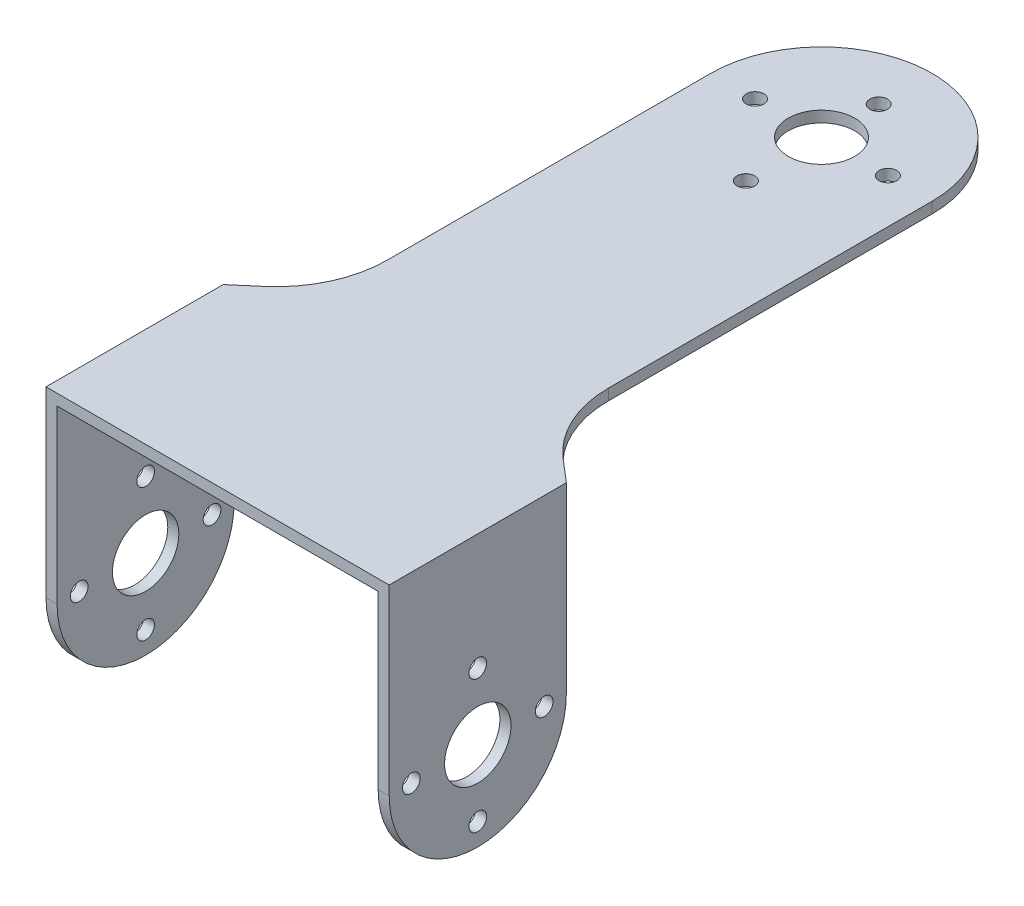
ISO-10303-21;
HEADER;
FILE_DESCRIPTION(('STEP AP214'),'2;1');
FILE_NAME('part.step','',(''),(''),'','','');
FILE_SCHEMA(('AUTOMOTIVE_DESIGN { 1 0 10303 214 1 1 1 1 }'));
ENDSEC;
DATA;
#1=APPLICATION_CONTEXT('core data for automotive mechanical design processes');
#2=APPLICATION_PROTOCOL_DEFINITION('international standard','automotive_design',2000,#1);
#3=PRODUCT_CONTEXT('',#1,'mechanical');
#4=PRODUCT('Part','Part','',(#3));
#5=PRODUCT_RELATED_PRODUCT_CATEGORY('part','',(#4));
#6=PRODUCT_DEFINITION_FORMATION('','',#4);
#7=PRODUCT_DEFINITION_CONTEXT('part definition',#1,'design');
#8=PRODUCT_DEFINITION('design','',#6,#7);
#9=PRODUCT_DEFINITION_SHAPE('','',#8);
#10=(LENGTH_UNIT() NAMED_UNIT(*) SI_UNIT(.MILLI.,.METRE.));
#11=(NAMED_UNIT(*) PLANE_ANGLE_UNIT() SI_UNIT($,.RADIAN.));
#12=(NAMED_UNIT(*) SI_UNIT($,.STERADIAN.) SOLID_ANGLE_UNIT());
#13=UNCERTAINTY_MEASURE_WITH_UNIT(LENGTH_MEASURE(1.E-05),#10,'distance_accuracy_value','');
#14=(GEOMETRIC_REPRESENTATION_CONTEXT(3) GLOBAL_UNCERTAINTY_ASSIGNED_CONTEXT((#13)) GLOBAL_UNIT_ASSIGNED_CONTEXT((#10,
#11,#12)) REPRESENTATION_CONTEXT('',''));
#15=CARTESIAN_POINT('',(0.,0.,0.));
#16=DIRECTION('',(0.,0.,1.));
#17=DIRECTION('',(1.,0.,0.));
#18=AXIS2_PLACEMENT_3D('',#15,#16,#17);
#19=CARTESIAN_POINT('',(31.,55.275594,-43.5206464472842));
#20=DIRECTION('',(0.,0.,1.));
#21=DIRECTION('',(1.,0.,0.));
#22=AXIS2_PLACEMENT_3D('',#19,#20,#21);
#23=PLANE('',#22);
#24=DIRECTION('',(0.,1.,0.));
#25=VECTOR('',#24,1.);
#26=CARTESIAN_POINT('',(0.999214171827738,55.275594,-43.5206464472842));
#27=LINE('',#26,#25);
#28=CARTESIAN_POINT('',(0.999214171827738,38.775594,-43.5206464472842));
#29=VERTEX_POINT('',#28);
#30=CARTESIAN_POINT('',(0.999214171827738,54.275594,-43.5206464472842));
#31=VERTEX_POINT('',#30);
#32=EDGE_CURVE('E161',#29,#31,#27,.T.);
#33=ORIENTED_EDGE('',*,*,#32,.F.);
#34=DIRECTION('',(-1.,0.,0.));
#35=VECTOR('',#34,1.);
#36=CARTESIAN_POINT('',(31.,38.775594,-43.5206464472842));
#37=LINE('',#36,#35);
#38=CARTESIAN_POINT('',(0.,38.775594,-43.5206464472842));
#39=VERTEX_POINT('',#38);
#40=EDGE_CURVE('E47',#29,#39,#37,.T.);
#41=ORIENTED_EDGE('',*,*,#40,.T.);
#42=DIRECTION('',(0.,1.,0.));
#43=VECTOR('',#42,1.);
#44=CARTESIAN_POINT('',(0.,55.275594,-43.5206464472842));
#45=LINE('',#44,#43);
#46=CARTESIAN_POINT('',(0.,54.275594,-43.5206464472842));
#47=VERTEX_POINT('',#46);
#48=EDGE_CURVE('E347',#39,#47,#45,.T.);
#49=ORIENTED_EDGE('',*,*,#48,.T.);
#50=DIRECTION('',(1.,0.,0.));
#51=VECTOR('',#50,1.);
#52=CARTESIAN_POINT('',(0.,54.275594,-43.5206464472842));
#53=LINE('',#52,#51);
#54=EDGE_CURVE('E252',#47,#31,#53,.T.);
#55=ORIENTED_EDGE('',*,*,#54,.T.);
#56=EDGE_LOOP('',(#33,#41,#49,#55));
#57=FACE_BOUND('',#56,.T.);
#58=ADVANCED_FACE('F39',(#57),#23,.F.);
#59=CARTESIAN_POINT('',(31.,38.775594,-35.5206464472841));
#60=DIRECTION('',(-1.,0.,0.));
#61=DIRECTION('',(0.,0.,1.));
#62=AXIS2_PLACEMENT_3D('',#59,#60,#61);
#63=CYLINDRICAL_SURFACE('',#62,8.);
#64=CARTESIAN_POINT('',(0.999214171827738,38.775594,-35.5206464472841));
#65=DIRECTION('',(1.,0.,0.));
#66=DIRECTION('',(0.,0.,-1.));
#67=AXIS2_PLACEMENT_3D('',#64,#65,#66);
#68=CIRCLE('',#67,8.);
#69=CARTESIAN_POINT('',(0.999214171827738,38.775594,-27.5206464472841));
#70=VERTEX_POINT('',#69);
#71=EDGE_CURVE('E213',#70,#29,#68,.T.);
#72=ORIENTED_EDGE('',*,*,#71,.F.);
#73=DIRECTION('',(-1.,0.,0.));
#74=VECTOR('',#73,1.);
#75=CARTESIAN_POINT('',(31.,38.775594,-27.5206464472841));
#76=LINE('',#75,#74);
#77=CARTESIAN_POINT('',(0.,38.775594,-27.5206464472841));
#78=VERTEX_POINT('',#77);
#79=EDGE_CURVE('E84',#70,#78,#76,.T.);
#80=ORIENTED_EDGE('',*,*,#79,.T.);
#81=CARTESIAN_POINT('',(0.,38.775594,-35.5206464472841));
#82=DIRECTION('',(1.,0.,0.));
#83=DIRECTION('',(0.,0.,-1.));
#84=AXIS2_PLACEMENT_3D('',#81,#82,#83);
#85=CIRCLE('',#84,8.);
#86=EDGE_CURVE('E336',#78,#39,#85,.T.);
#87=ORIENTED_EDGE('',*,*,#86,.T.);
#88=ORIENTED_EDGE('',*,*,#40,.F.);
#89=EDGE_LOOP('',(#72,#80,#87,#88));
#90=FACE_BOUND('',#89,.T.);
#91=ADVANCED_FACE('F41',(#90),#63,.T.);
#92=CARTESIAN_POINT('',(31.,38.775594,-27.5206464472841));
#93=VERTEX_POINT('',#92);
#94=CARTESIAN_POINT('',(30.0007858281723,38.775594,-27.5206464472841));
#95=VERTEX_POINT('',#94);
#96=EDGE_CURVE('E353',#93,#95,#76,.T.);
#97=ORIENTED_EDGE('',*,*,#96,.T.);
#98=CARTESIAN_POINT('',(30.0007858281723,38.775594,-35.5206464472841));
#99=DIRECTION('',(1.,0.,0.));
#100=DIRECTION('',(0.,0.,-1.));
#101=AXIS2_PLACEMENT_3D('',#98,#99,#100);
#102=CIRCLE('',#101,8.);
#103=CARTESIAN_POINT('',(30.0007858281723,38.775594,-43.5206464472842));
#104=VERTEX_POINT('',#103);
#105=EDGE_CURVE('E192',#95,#104,#102,.T.);
#106=ORIENTED_EDGE('',*,*,#105,.T.);
#107=CARTESIAN_POINT('',(31.,38.775594,-43.5206464472842));
#108=VERTEX_POINT('',#107);
#109=EDGE_CURVE('E11',#108,#104,#37,.T.);
#110=ORIENTED_EDGE('',*,*,#109,.F.);
#111=CARTESIAN_POINT('',(31.,38.775594,-35.5206464472841));
#112=DIRECTION('',(1.,0.,0.));
#113=DIRECTION('',(0.,0.,-1.));
#114=AXIS2_PLACEMENT_3D('',#111,#112,#113);
#115=CIRCLE('',#114,8.);
#116=EDGE_CURVE('E339',#93,#108,#115,.T.);
#117=ORIENTED_EDGE('',*,*,#116,.F.);
#118=EDGE_LOOP('',(#97,#106,#110,#117));
#119=FACE_BOUND('',#118,.T.);
#120=ADVANCED_FACE('F369',(#119),#63,.T.);
#121=CARTESIAN_POINT('',(31.,38.775594,-27.5206464472841));
#122=DIRECTION('',(0.,0.,-1.));
#123=DIRECTION('',(-1.,0.,0.));
#124=AXIS2_PLACEMENT_3D('',#121,#122,#123);
#125=PLANE('',#124);
#126=DIRECTION('',(0.,1.,0.));
#127=VECTOR('',#126,1.);
#128=CARTESIAN_POINT('',(0.999214171827738,30.775594,-27.5206464472841));
#129=LINE('',#128,#127);
#130=CARTESIAN_POINT('',(0.999214171827738,54.275594,-27.5206464472841));
#131=VERTEX_POINT('',#130);
#132=EDGE_CURVE('E159',#70,#131,#129,.T.);
#133=ORIENTED_EDGE('',*,*,#132,.T.);
#134=DIRECTION('',(1.,0.,0.));
#135=VECTOR('',#134,1.);
#136=CARTESIAN_POINT('',(0.,54.275594,-27.5206464472841));
#137=LINE('',#136,#135);
#138=CARTESIAN_POINT('',(30.0007858281723,54.275594,-27.5206464472841));
#139=VERTEX_POINT('',#138);
#140=EDGE_CURVE('E163',#131,#139,#137,.T.);
#141=ORIENTED_EDGE('',*,*,#140,.T.);
#142=DIRECTION('',(0.,1.,0.));
#143=VECTOR('',#142,1.);
#144=CARTESIAN_POINT('',(30.0007858281723,30.775594,-27.5206464472841));
#145=LINE('',#144,#143);
#146=EDGE_CURVE('E172',#95,#139,#145,.T.);
#147=ORIENTED_EDGE('',*,*,#146,.F.);
#148=ORIENTED_EDGE('',*,*,#96,.F.);
#149=DIRECTION('',(0.,-1.,0.));
#150=VECTOR('',#149,1.);
#151=CARTESIAN_POINT('',(31.,38.775594,-27.5206464472841));
#152=LINE('',#151,#150);
#153=CARTESIAN_POINT('',(31.,55.275594,-27.5206464472841));
#154=VERTEX_POINT('',#153);
#155=EDGE_CURVE('E63',#154,#93,#152,.T.);
#156=ORIENTED_EDGE('',*,*,#155,.F.);
#157=DIRECTION('',(-1.,0.,0.));
#158=VECTOR('',#157,1.);
#159=CARTESIAN_POINT('',(31.,55.275594,-27.5206464472841));
#160=LINE('',#159,#158);
#161=CARTESIAN_POINT('',(0.,55.275594,-27.5206464472841));
#162=VERTEX_POINT('',#161);
#163=EDGE_CURVE('E355',#154,#162,#160,.T.);
#164=ORIENTED_EDGE('',*,*,#163,.T.);
#165=DIRECTION('',(0.,-1.,0.));
#166=VECTOR('',#165,1.);
#167=CARTESIAN_POINT('',(0.,38.775594,-27.5206464472841));
#168=LINE('',#167,#166);
#169=EDGE_CURVE('E341',#162,#78,#168,.T.);
#170=ORIENTED_EDGE('',*,*,#169,.T.);
#171=ORIENTED_EDGE('',*,*,#79,.F.);
#172=EDGE_LOOP('',(#133,#141,#147,#148,#156,#164,#170,#171));
#173=FACE_BOUND('',#172,.T.);
#174=ADVANCED_FACE('F171',(#173),#125,.F.);
#175=CARTESIAN_POINT('',(31.,44.775594,-35.5206464472841));
#176=DIRECTION('',(-1.,0.,0.));
#177=DIRECTION('',(0.,0.,1.));
#178=AXIS2_PLACEMENT_3D('',#175,#176,#177);
#179=CYLINDRICAL_SURFACE('',#178,0.799999999999996);
#180=CARTESIAN_POINT('',(0.,44.775594,-35.5206464472841));
#181=DIRECTION('',(1.,0.,0.));
#182=DIRECTION('',(0.,0.,-1.));
#183=AXIS2_PLACEMENT_3D('',#180,#181,#182);
#184=CIRCLE('',#183,0.799999999999996);
#185=CARTESIAN_POINT('',(0.,44.775594,-36.3206464472841));
#186=VERTEX_POINT('',#185);
#187=EDGE_CURVE('E330',#186,#186,#184,.T.);
#188=ORIENTED_EDGE('',*,*,#187,.F.);
#189=EDGE_LOOP('',(#188));
#190=FACE_BOUND('',#189,.T.);
#191=CARTESIAN_POINT('',(0.999214171827738,44.775594,-35.5206464472841));
#192=DIRECTION('',(1.,0.,0.));
#193=DIRECTION('',(0.,0.,-1.));
#194=AXIS2_PLACEMENT_3D('',#191,#192,#193);
#195=CIRCLE('',#194,0.799999999999996);
#196=CARTESIAN_POINT('',(0.999214171827738,44.775594,-36.3206464472841));
#197=VERTEX_POINT('',#196);
#198=EDGE_CURVE('E210',#197,#197,#195,.T.);
#199=ORIENTED_EDGE('',*,*,#198,.T.);
#200=EDGE_LOOP('',(#199));
#201=FACE_BOUND('',#200,.T.);
#202=ADVANCED_FACE('F476',(#190,#201),#179,.F.);
#203=CARTESIAN_POINT('',(31.,38.775594,-35.5206464472841));
#204=DIRECTION('',(-1.,0.,0.));
#205=DIRECTION('',(0.,0.,1.));
#206=AXIS2_PLACEMENT_3D('',#203,#204,#205);
#207=CYLINDRICAL_SURFACE('',#206,3.);
#208=CARTESIAN_POINT('',(0.,38.775594,-35.5206464472841));
#209=DIRECTION('',(1.,0.,0.));
#210=DIRECTION('',(0.,0.,-1.));
#211=AXIS2_PLACEMENT_3D('',#208,#209,#210);
#212=CIRCLE('',#211,3.);
#213=CARTESIAN_POINT('',(0.,38.775594,-38.5206464472841));
#214=VERTEX_POINT('',#213);
#215=EDGE_CURVE('E324',#214,#214,#212,.T.);
#216=ORIENTED_EDGE('',*,*,#215,.F.);
#217=EDGE_LOOP('',(#216));
#218=FACE_BOUND('',#217,.T.);
#219=CARTESIAN_POINT('',(0.999214171827738,38.775594,-35.5206464472841));
#220=DIRECTION('',(1.,0.,0.));
#221=DIRECTION('',(0.,0.,-1.));
#222=AXIS2_PLACEMENT_3D('',#219,#220,#221);
#223=CIRCLE('',#222,3.);
#224=CARTESIAN_POINT('',(0.999214171827738,38.775594,-38.5206464472841));
#225=VERTEX_POINT('',#224);
#226=EDGE_CURVE('E207',#225,#225,#223,.T.);
#227=ORIENTED_EDGE('',*,*,#226,.T.);
#228=EDGE_LOOP('',(#227));
#229=FACE_BOUND('',#228,.T.);
#230=ADVANCED_FACE('F473',(#218,#229),#207,.F.);
#231=CARTESIAN_POINT('',(31.,38.775594,-41.5158813921745));
#232=DIRECTION('',(-1.,0.,0.));
#233=DIRECTION('',(0.,0.,1.));
#234=AXIS2_PLACEMENT_3D('',#231,#232,#233);
#235=CYLINDRICAL_SURFACE('',#234,0.800000000000003);
#236=CARTESIAN_POINT('',(0.,38.775594,-41.5158813921745));
#237=DIRECTION('',(1.,0.,0.));
#238=DIRECTION('',(0.,0.,-1.));
#239=AXIS2_PLACEMENT_3D('',#236,#237,#238);
#240=CIRCLE('',#239,0.800000000000003);
#241=CARTESIAN_POINT('',(0.,38.775594,-42.3158813921745));
#242=VERTEX_POINT('',#241);
#243=EDGE_CURVE('E318',#242,#242,#240,.T.);
#244=ORIENTED_EDGE('',*,*,#243,.F.);
#245=EDGE_LOOP('',(#244));
#246=FACE_BOUND('',#245,.T.);
#247=CARTESIAN_POINT('',(0.999214171827738,38.775594,-41.5158813921745));
#248=DIRECTION('',(1.,0.,0.));
#249=DIRECTION('',(0.,0.,-1.));
#250=AXIS2_PLACEMENT_3D('',#247,#248,#249);
#251=CIRCLE('',#250,0.800000000000003);
#252=CARTESIAN_POINT('',(0.999214171827738,38.775594,-42.3158813921745));
#253=VERTEX_POINT('',#252);
#254=EDGE_CURVE('E204',#253,#253,#251,.T.);
#255=ORIENTED_EDGE('',*,*,#254,.T.);
#256=EDGE_LOOP('',(#255));
#257=FACE_BOUND('',#256,.T.);
#258=ADVANCED_FACE('F468',(#246,#257),#235,.F.);
#259=CARTESIAN_POINT('',(31.,32.775594,-35.5206464472841));
#260=DIRECTION('',(-1.,0.,0.));
#261=DIRECTION('',(0.,0.,1.));
#262=AXIS2_PLACEMENT_3D('',#259,#260,#261);
#263=CYLINDRICAL_SURFACE('',#262,0.799999999999996);
#264=CARTESIAN_POINT('',(0.,32.775594,-35.5206464472841));
#265=DIRECTION('',(1.,0.,0.));
#266=DIRECTION('',(0.,0.,-1.));
#267=AXIS2_PLACEMENT_3D('',#264,#265,#266);
#268=CIRCLE('',#267,0.799999999999996);
#269=CARTESIAN_POINT('',(0.,32.775594,-36.3206464472841));
#270=VERTEX_POINT('',#269);
#271=EDGE_CURVE('E312',#270,#270,#268,.T.);
#272=ORIENTED_EDGE('',*,*,#271,.F.);
#273=EDGE_LOOP('',(#272));
#274=FACE_BOUND('',#273,.T.);
#275=CARTESIAN_POINT('',(0.999214171827738,32.775594,-35.5206464472841));
#276=DIRECTION('',(1.,0.,0.));
#277=DIRECTION('',(0.,0.,-1.));
#278=AXIS2_PLACEMENT_3D('',#275,#276,#277);
#279=CIRCLE('',#278,0.799999999999996);
#280=CARTESIAN_POINT('',(0.999214171827738,32.775594,-36.3206464472841));
#281=VERTEX_POINT('',#280);
#282=EDGE_CURVE('E201',#281,#281,#279,.T.);
#283=ORIENTED_EDGE('',*,*,#282,.T.);
#284=EDGE_LOOP('',(#283));
#285=FACE_BOUND('',#284,.T.);
#286=ADVANCED_FACE('F390',(#274,#285),#263,.F.);
#287=CARTESIAN_POINT('',(31.,38.775594,-29.5158813921745));
#288=DIRECTION('',(-1.,0.,0.));
#289=DIRECTION('',(0.,0.,1.));
#290=AXIS2_PLACEMENT_3D('',#287,#288,#289);
#291=CYLINDRICAL_SURFACE('',#290,0.799999999999996);
#292=CARTESIAN_POINT('',(0.,38.775594,-29.5158813921745));
#293=DIRECTION('',(1.,0.,0.));
#294=DIRECTION('',(0.,0.,-1.));
#295=AXIS2_PLACEMENT_3D('',#292,#293,#294);
#296=CIRCLE('',#295,0.799999999999996);
#297=CARTESIAN_POINT('',(0.,38.775594,-30.3158813921745));
#298=VERTEX_POINT('',#297);
#299=EDGE_CURVE('E293',#298,#298,#296,.T.);
#300=ORIENTED_EDGE('',*,*,#299,.F.);
#301=EDGE_LOOP('',(#300));
#302=FACE_BOUND('',#301,.T.);
#303=CARTESIAN_POINT('',(0.999214171827738,38.775594,-29.5158813921745));
#304=DIRECTION('',(1.,0.,0.));
#305=DIRECTION('',(0.,0.,-1.));
#306=AXIS2_PLACEMENT_3D('',#303,#304,#305);
#307=CIRCLE('',#306,0.799999999999996);
#308=CARTESIAN_POINT('',(0.999214171827738,38.775594,-30.3158813921745));
#309=VERTEX_POINT('',#308);
#310=EDGE_CURVE('E198',#309,#309,#307,.T.);
#311=ORIENTED_EDGE('',*,*,#310,.T.);
#312=EDGE_LOOP('',(#311));
#313=FACE_BOUND('',#312,.T.);
#314=ADVANCED_FACE('F382',(#302,#313),#291,.F.);
#315=ORIENTED_EDGE('',*,*,#109,.T.);
#316=DIRECTION('',(0.,1.,0.));
#317=VECTOR('',#316,1.);
#318=CARTESIAN_POINT('',(30.0007858281723,55.275594,-43.5206464472842));
#319=LINE('',#318,#317);
#320=CARTESIAN_POINT('',(30.0007858281723,54.275594,-43.5206464472842));
#321=VERTEX_POINT('',#320);
#322=EDGE_CURVE('E195',#104,#321,#319,.T.);
#323=ORIENTED_EDGE('',*,*,#322,.T.);
#324=CARTESIAN_POINT('',(31.,54.275594,-43.5206464472842));
#325=VERTEX_POINT('',#324);
#326=EDGE_CURVE('E250',#321,#325,#53,.T.);
#327=ORIENTED_EDGE('',*,*,#326,.T.);
#328=DIRECTION('',(0.,1.,0.));
#329=VECTOR('',#328,1.);
#330=CARTESIAN_POINT('',(31.,55.275594,-43.5206464472842));
#331=LINE('',#330,#329);
#332=EDGE_CURVE('E90',#108,#325,#331,.T.);
#333=ORIENTED_EDGE('',*,*,#332,.F.);
#334=EDGE_LOOP('',(#315,#323,#327,#333));
#335=FACE_BOUND('',#334,.T.);
#336=ADVANCED_FACE('F375',(#335),#23,.F.);
#337=CARTESIAN_POINT('',(31.,38.775594,-35.5206464472841));
#338=DIRECTION('',(1.,0.,0.));
#339=DIRECTION('',(0.,0.,-1.));
#340=AXIS2_PLACEMENT_3D('',#337,#338,#339);
#341=PLANE('',#340);
#342=CARTESIAN_POINT('',(31.,32.775594,-35.5206464472841));
#343=DIRECTION('',(1.,0.,0.));
#344=DIRECTION('',(0.,0.,-1.));
#345=AXIS2_PLACEMENT_3D('',#342,#343,#344);
#346=CIRCLE('',#345,0.799999999999996);
#347=CARTESIAN_POINT('',(31.,32.775594,-36.3206464472841));
#348=VERTEX_POINT('',#347);
#349=EDGE_CURVE('E315',#348,#348,#346,.T.);
#350=ORIENTED_EDGE('',*,*,#349,.F.);
#351=EDGE_LOOP('',(#350));
#352=FACE_BOUND('',#351,.T.);
#353=CARTESIAN_POINT('',(31.,38.775594,-35.5206464472841));
#354=DIRECTION('',(1.,0.,0.));
#355=DIRECTION('',(0.,0.,-1.));
#356=AXIS2_PLACEMENT_3D('',#353,#354,#355);
#357=CIRCLE('',#356,3.);
#358=CARTESIAN_POINT('',(31.,38.775594,-38.5206464472841));
#359=VERTEX_POINT('',#358);
#360=EDGE_CURVE('E327',#359,#359,#357,.T.);
#361=ORIENTED_EDGE('',*,*,#360,.F.);
#362=EDGE_LOOP('',(#361));
#363=FACE_BOUND('',#362,.T.);
#364=ORIENTED_EDGE('',*,*,#116,.T.);
#365=ORIENTED_EDGE('',*,*,#332,.T.);
#366=DIRECTION('',(0.,1.,0.));
#367=VECTOR('',#366,1.);
#368=CARTESIAN_POINT('',(31.,54.275594,-43.5206464472842));
#369=LINE('',#368,#367);
#370=CARTESIAN_POINT('',(31.,55.275594,-43.5206464472842));
#371=VERTEX_POINT('',#370);
#372=EDGE_CURVE('E304',#325,#371,#369,.T.);
#373=ORIENTED_EDGE('',*,*,#372,.T.);
#374=DIRECTION('',(0.,0.,1.));
#375=VECTOR('',#374,1.);
#376=CARTESIAN_POINT('',(31.,55.275594,-27.5206464472841));
#377=LINE('',#376,#375);
#378=EDGE_CURVE('E343',#371,#154,#377,.T.);
#379=ORIENTED_EDGE('',*,*,#378,.T.);
#380=ORIENTED_EDGE('',*,*,#155,.T.);
#381=EDGE_LOOP('',(#364,#365,#373,#379,#380));
#382=FACE_BOUND('',#381,.T.);
#383=CARTESIAN_POINT('',(31.,44.775594,-35.5206464472841));
#384=DIRECTION('',(1.,0.,0.));
#385=DIRECTION('',(0.,0.,-1.));
#386=AXIS2_PLACEMENT_3D('',#383,#384,#385);
#387=CIRCLE('',#386,0.799999999999996);
#388=CARTESIAN_POINT('',(31.,44.775594,-36.3206464472841));
#389=VERTEX_POINT('',#388);
#390=EDGE_CURVE('E333',#389,#389,#387,.T.);
#391=ORIENTED_EDGE('',*,*,#390,.F.);
#392=EDGE_LOOP('',(#391));
#393=FACE_BOUND('',#392,.T.);
#394=CARTESIAN_POINT('',(31.,38.775594,-41.5158813921745));
#395=DIRECTION('',(1.,0.,0.));
#396=DIRECTION('',(0.,0.,-1.));
#397=AXIS2_PLACEMENT_3D('',#394,#395,#396);
#398=CIRCLE('',#397,0.800000000000003);
#399=CARTESIAN_POINT('',(31.,38.775594,-42.3158813921745));
#400=VERTEX_POINT('',#399);
#401=EDGE_CURVE('E321',#400,#400,#398,.T.);
#402=ORIENTED_EDGE('',*,*,#401,.F.);
#403=EDGE_LOOP('',(#402));
#404=FACE_BOUND('',#403,.T.);
#405=CARTESIAN_POINT('',(31.,38.775594,-29.5158813921745));
#406=DIRECTION('',(1.,0.,0.));
#407=DIRECTION('',(0.,0.,-1.));
#408=AXIS2_PLACEMENT_3D('',#405,#406,#407);
#409=CIRCLE('',#408,0.799999999999996);
#410=CARTESIAN_POINT('',(31.,38.775594,-30.3158813921745));
#411=VERTEX_POINT('',#410);
#412=EDGE_CURVE('E309',#411,#411,#409,.T.);
#413=ORIENTED_EDGE('',*,*,#412,.F.);
#414=EDGE_LOOP('',(#413));
#415=FACE_BOUND('',#414,.T.);
#416=ADVANCED_FACE('F381',(#352,#363,#382,#393,#404,#415),#341,.T.);
#417=CARTESIAN_POINT('',(0.,38.775594,-35.5206464472841));
#418=DIRECTION('',(1.,0.,0.));
#419=DIRECTION('',(0.,0.,-1.));
#420=AXIS2_PLACEMENT_3D('',#417,#418,#419);
#421=PLANE('',#420);
#422=ORIENTED_EDGE('',*,*,#86,.F.);
#423=ORIENTED_EDGE('',*,*,#169,.F.);
#424=DIRECTION('',(0.,0.,1.));
#425=VECTOR('',#424,1.);
#426=CARTESIAN_POINT('',(0.,55.275594,-27.5206464472841));
#427=LINE('',#426,#425);
#428=CARTESIAN_POINT('',(0.,55.275594,-43.5206464472842));
#429=VERTEX_POINT('',#428);
#430=EDGE_CURVE('E350',#429,#162,#427,.T.);
#431=ORIENTED_EDGE('',*,*,#430,.F.);
#432=DIRECTION('',(0.,1.,0.));
#433=VECTOR('',#432,1.);
#434=CARTESIAN_POINT('',(0.,54.275594,-43.5206464472842));
#435=LINE('',#434,#433);
#436=EDGE_CURVE('E272',#47,#429,#435,.T.);
#437=ORIENTED_EDGE('',*,*,#436,.F.);
#438=ORIENTED_EDGE('',*,*,#48,.F.);
#439=EDGE_LOOP('',(#422,#423,#431,#437,#438));
#440=FACE_BOUND('',#439,.T.);
#441=ORIENTED_EDGE('',*,*,#187,.T.);
#442=EDGE_LOOP('',(#441));
#443=FACE_BOUND('',#442,.T.);
#444=ORIENTED_EDGE('',*,*,#215,.T.);
#445=EDGE_LOOP('',(#444));
#446=FACE_BOUND('',#445,.T.);
#447=ORIENTED_EDGE('',*,*,#243,.T.);
#448=EDGE_LOOP('',(#447));
#449=FACE_BOUND('',#448,.T.);
#450=ORIENTED_EDGE('',*,*,#271,.T.);
#451=EDGE_LOOP('',(#450));
#452=FACE_BOUND('',#451,.T.);
#453=ORIENTED_EDGE('',*,*,#299,.T.);
#454=EDGE_LOOP('',(#453));
#455=FACE_BOUND('',#454,.T.);
#456=ADVANCED_FACE('F365',(#440,#443,#446,#449,#452,#455),#421,.F.);
#457=CARTESIAN_POINT('',(31.,55.275594,-27.5206464472841));
#458=DIRECTION('',(0.,-1.,0.));
#459=DIRECTION('',(0.,0.,-1.));
#460=AXIS2_PLACEMENT_3D('',#457,#458,#459);
#461=PLANE('',#460);
#462=CARTESIAN_POINT('',(15.5,55.275594,-82.066093120228));
#463=DIRECTION('',(0.,-1.,0.));
#464=DIRECTION('',(0.,0.,-1.));
#465=AXIS2_PLACEMENT_3D('',#462,#463,#464);
#466=CIRCLE('',#465,3.);
#467=CARTESIAN_POINT('',(15.5,55.275594,-85.066093120228));
#468=VERTEX_POINT('',#467);
#469=EDGE_CURVE('E217',#468,#468,#466,.T.);
#470=ORIENTED_EDGE('',*,*,#469,.T.);
#471=EDGE_LOOP('',(#470));
#472=FACE_BOUND('',#471,.T.);
#473=CARTESIAN_POINT('',(21.5,55.275594,-82.066093120228));
#474=DIRECTION('',(0.,-1.,0.));
#475=DIRECTION('',(0.,0.,-1.));
#476=AXIS2_PLACEMENT_3D('',#473,#474,#475);
#477=CIRCLE('',#476,0.800000000000001);
#478=CARTESIAN_POINT('',(21.5,55.275594,-82.866093120228));
#479=VERTEX_POINT('',#478);
#480=EDGE_CURVE('E223',#479,#479,#477,.T.);
#481=ORIENTED_EDGE('',*,*,#480,.T.);
#482=EDGE_LOOP('',(#481));
#483=FACE_BOUND('',#482,.T.);
#484=CARTESIAN_POINT('',(15.5,55.275594,-87.2360931180725));
#485=DIRECTION('',(0.,-1.,0.));
#486=DIRECTION('',(0.,0.,-1.));
#487=AXIS2_PLACEMENT_3D('',#484,#485,#486);
#488=CIRCLE('',#487,0.799999999999996);
#489=CARTESIAN_POINT('',(15.5,55.275594,-88.0360931180725));
#490=VERTEX_POINT('',#489);
#491=EDGE_CURVE('E233',#490,#490,#488,.T.);
#492=ORIENTED_EDGE('',*,*,#491,.T.);
#493=EDGE_LOOP('',(#492));
#494=FACE_BOUND('',#493,.T.);
#495=CARTESIAN_POINT('',(9.5,55.275594,-82.066093120228));
#496=DIRECTION('',(0.,-1.,0.));
#497=DIRECTION('',(0.,0.,-1.));
#498=AXIS2_PLACEMENT_3D('',#495,#496,#497);
#499=CIRCLE('',#498,0.799999999999998);
#500=CARTESIAN_POINT('',(9.5,55.275594,-82.866093120228));
#501=VERTEX_POINT('',#500);
#502=EDGE_CURVE('E239',#501,#501,#499,.T.);
#503=ORIENTED_EDGE('',*,*,#502,.T.);
#504=EDGE_LOOP('',(#503));
#505=FACE_BOUND('',#504,.T.);
#506=CARTESIAN_POINT('',(15.5,55.275594,-75.2360931180725));
#507=DIRECTION('',(0.,-1.,0.));
#508=DIRECTION('',(0.,0.,-1.));
#509=AXIS2_PLACEMENT_3D('',#506,#507,#508);
#510=CIRCLE('',#509,0.799999999999996);
#511=CARTESIAN_POINT('',(15.5,55.275594,-76.0360931180725));
#512=VERTEX_POINT('',#511);
#513=EDGE_CURVE('E220',#512,#512,#510,.T.);
#514=ORIENTED_EDGE('',*,*,#513,.T.);
#515=EDGE_LOOP('',(#514));
#516=FACE_BOUND('',#515,.T.);
#517=ORIENTED_EDGE('',*,*,#430,.T.);
#518=ORIENTED_EDGE('',*,*,#163,.F.);
#519=ORIENTED_EDGE('',*,*,#378,.F.);
#520=DIRECTION('',(-0.759177414665912,0.,-0.650883747731637));
#521=VECTOR('',#520,1.);
#522=CARTESIAN_POINT('',(28.9911625226837,55.275594,-45.2429311735689));
#523=LINE('',#522,#521);
#524=CARTESIAN_POINT('',(28.9911625226837,55.275594,-45.2429311735689));
#525=VERTEX_POINT('',#524);
#526=EDGE_CURVE('E274',#371,#525,#523,.T.);
#527=ORIENTED_EDGE('',*,*,#526,.T.);
#528=CARTESIAN_POINT('',(35.5,55.275594,-52.834705320228));
#529=DIRECTION('',(0.,-1.,0.));
#530=DIRECTION('',(0.,0.,1.));
#531=AXIS2_PLACEMENT_3D('',#528,#529,#530);
#532=CIRCLE('',#531,10.);
#533=CARTESIAN_POINT('',(25.5,55.275594,-52.8347053202281));
#534=VERTEX_POINT('',#533);
#535=EDGE_CURVE('E277',#525,#534,#532,.T.);
#536=ORIENTED_EDGE('',*,*,#535,.T.);
#537=DIRECTION('',(0.,0.,-1.));
#538=VECTOR('',#537,1.);
#539=CARTESIAN_POINT('',(25.5,55.275594,-82.066093120228));
#540=LINE('',#539,#538);
#541=CARTESIAN_POINT('',(25.5,55.275594,-82.066093120228));
#542=VERTEX_POINT('',#541);
#543=EDGE_CURVE('E280',#534,#542,#540,.T.);
#544=ORIENTED_EDGE('',*,*,#543,.T.);
#545=CARTESIAN_POINT('',(15.5,55.275594,-82.066093120228));
#546=DIRECTION('',(0.,1.,0.));
#547=DIRECTION('',(0.,0.,1.));
#548=AXIS2_PLACEMENT_3D('',#545,#546,#547);
#549=CIRCLE('',#548,10.);
#550=CARTESIAN_POINT('',(5.5,55.275594,-82.066093120228));
#551=VERTEX_POINT('',#550);
#552=EDGE_CURVE('E283',#542,#551,#549,.T.);
#553=ORIENTED_EDGE('',*,*,#552,.T.);
#554=DIRECTION('',(0.,0.,1.));
#555=VECTOR('',#554,1.);
#556=CARTESIAN_POINT('',(5.5,55.275594,-82.066093120228));
#557=LINE('',#556,#555);
#558=CARTESIAN_POINT('',(5.50000000000001,55.275594,-52.8347053202281));
#559=VERTEX_POINT('',#558);
#560=EDGE_CURVE('E286',#551,#559,#557,.T.);
#561=ORIENTED_EDGE('',*,*,#560,.T.);
#562=CARTESIAN_POINT('',(-4.5,55.275594,-52.834705320228));
#563=DIRECTION('',(0.,-1.,0.));
#564=DIRECTION('',(0.,0.,-1.));
#565=AXIS2_PLACEMENT_3D('',#562,#563,#564);
#566=CIRCLE('',#565,10.);
#567=CARTESIAN_POINT('',(2.00883747731635,55.275594,-45.2429311735689));
#568=VERTEX_POINT('',#567);
#569=EDGE_CURVE('E251',#559,#568,#566,.T.);
#570=ORIENTED_EDGE('',*,*,#569,.T.);
#571=DIRECTION('',(-0.759177414665912,0.,0.650883747731638));
#572=VECTOR('',#571,1.);
#573=CARTESIAN_POINT('',(2.00883747731635,55.275594,-45.2429311735689));
#574=LINE('',#573,#572);
#575=EDGE_CURVE('E226',#568,#429,#574,.T.);
#576=ORIENTED_EDGE('',*,*,#575,.T.);
#577=EDGE_LOOP('',(#517,#518,#519,#527,#536,#544,#553,#561,#570,#576));
#578=FACE_BOUND('',#577,.T.);
#579=ADVANCED_FACE('F474',(#472,#483,#494,#505,#516,#578),#461,.F.);
#580=CARTESIAN_POINT('',(30.0007858281723,44.775594,-35.5206464472841));
#581=DIRECTION('',(1.,0.,0.));
#582=DIRECTION('',(0.,0.,-1.));
#583=AXIS2_PLACEMENT_3D('',#580,#581,#582);
#584=CIRCLE('',#583,0.799999999999996);
#585=CARTESIAN_POINT('',(30.0007858281723,44.775594,-36.3206464472841));
#586=VERTEX_POINT('',#585);
#587=EDGE_CURVE('E189',#586,#586,#584,.T.);
#588=ORIENTED_EDGE('',*,*,#587,.F.);
#589=EDGE_LOOP('',(#588));
#590=FACE_BOUND('',#589,.T.);
#591=ORIENTED_EDGE('',*,*,#390,.T.);
#592=EDGE_LOOP('',(#591));
#593=FACE_BOUND('',#592,.T.);
#594=ADVANCED_FACE('F471',(#590,#593),#179,.F.);
#595=CARTESIAN_POINT('',(30.0007858281723,38.775594,-35.5206464472841));
#596=DIRECTION('',(1.,0.,0.));
#597=DIRECTION('',(0.,0.,-1.));
#598=AXIS2_PLACEMENT_3D('',#595,#596,#597);
#599=CIRCLE('',#598,3.);
#600=CARTESIAN_POINT('',(30.0007858281723,38.775594,-38.5206464472841));
#601=VERTEX_POINT('',#600);
#602=EDGE_CURVE('E186',#601,#601,#599,.T.);
#603=ORIENTED_EDGE('',*,*,#602,.F.);
#604=EDGE_LOOP('',(#603));
#605=FACE_BOUND('',#604,.T.);
#606=ORIENTED_EDGE('',*,*,#360,.T.);
#607=EDGE_LOOP('',(#606));
#608=FACE_BOUND('',#607,.T.);
#609=ADVANCED_FACE('F466',(#605,#608),#207,.F.);
#610=CARTESIAN_POINT('',(30.0007858281723,38.775594,-41.5158813921745));
#611=DIRECTION('',(1.,0.,0.));
#612=DIRECTION('',(0.,0.,-1.));
#613=AXIS2_PLACEMENT_3D('',#610,#611,#612);
#614=CIRCLE('',#613,0.800000000000003);
#615=CARTESIAN_POINT('',(30.0007858281723,38.775594,-42.3158813921745));
#616=VERTEX_POINT('',#615);
#617=EDGE_CURVE('E183',#616,#616,#614,.T.);
#618=ORIENTED_EDGE('',*,*,#617,.F.);
#619=EDGE_LOOP('',(#618));
#620=FACE_BOUND('',#619,.T.);
#621=ORIENTED_EDGE('',*,*,#401,.T.);
#622=EDGE_LOOP('',(#621));
#623=FACE_BOUND('',#622,.T.);
#624=ADVANCED_FACE('F462',(#620,#623),#235,.F.);
#625=CARTESIAN_POINT('',(30.0007858281723,32.775594,-35.5206464472841));
#626=DIRECTION('',(1.,0.,0.));
#627=DIRECTION('',(0.,0.,-1.));
#628=AXIS2_PLACEMENT_3D('',#625,#626,#627);
#629=CIRCLE('',#628,0.799999999999996);
#630=CARTESIAN_POINT('',(30.0007858281723,32.775594,-36.3206464472841));
#631=VERTEX_POINT('',#630);
#632=EDGE_CURVE('E180',#631,#631,#629,.T.);
#633=ORIENTED_EDGE('',*,*,#632,.F.);
#634=EDGE_LOOP('',(#633));
#635=FACE_BOUND('',#634,.T.);
#636=ORIENTED_EDGE('',*,*,#349,.T.);
#637=EDGE_LOOP('',(#636));
#638=FACE_BOUND('',#637,.T.);
#639=ADVANCED_FACE('F458',(#635,#638),#263,.F.);
#640=CARTESIAN_POINT('',(30.0007858281723,38.775594,-29.5158813921745));
#641=DIRECTION('',(1.,0.,0.));
#642=DIRECTION('',(0.,0.,-1.));
#643=AXIS2_PLACEMENT_3D('',#640,#641,#642);
#644=CIRCLE('',#643,0.799999999999996);
#645=CARTESIAN_POINT('',(30.0007858281723,38.775594,-30.3158813921745));
#646=VERTEX_POINT('',#645);
#647=EDGE_CURVE('E174',#646,#646,#644,.T.);
#648=ORIENTED_EDGE('',*,*,#647,.F.);
#649=EDGE_LOOP('',(#648));
#650=FACE_BOUND('',#649,.T.);
#651=ORIENTED_EDGE('',*,*,#412,.T.);
#652=EDGE_LOOP('',(#651));
#653=FACE_BOUND('',#652,.T.);
#654=ADVANCED_FACE('F393',(#650,#653),#291,.F.);
#655=CARTESIAN_POINT('',(2.00883747731635,54.275594,-45.2429311735689));
#656=DIRECTION('',(-0.650883747731638,0.,-0.759177414665912));
#657=DIRECTION('',(-0.759177414665912,0.,0.650883747731638));
#658=AXIS2_PLACEMENT_3D('',#655,#656,#657);
#659=PLANE('',#658);
#660=ORIENTED_EDGE('',*,*,#575,.F.);
#661=DIRECTION('',(0.,1.,0.));
#662=VECTOR('',#661,1.);
#663=CARTESIAN_POINT('',(2.00883747731635,54.275594,-45.2429311735689));
#664=LINE('',#663,#662);
#665=CARTESIAN_POINT('',(2.00883747731635,54.275594,-45.2429311735689));
#666=VERTEX_POINT('',#665);
#667=EDGE_CURVE('E291',#666,#568,#664,.T.);
#668=ORIENTED_EDGE('',*,*,#667,.F.);
#669=DIRECTION('',(-0.759177414665912,0.,0.650883747731638));
#670=VECTOR('',#669,1.);
#671=CARTESIAN_POINT('',(2.00883747731635,54.275594,-45.2429311735689));
#672=LINE('',#671,#670);
#673=EDGE_CURVE('E247',#666,#47,#672,.T.);
#674=ORIENTED_EDGE('',*,*,#673,.T.);
#675=ORIENTED_EDGE('',*,*,#436,.T.);
#676=EDGE_LOOP('',(#660,#668,#674,#675));
#677=FACE_BOUND('',#676,.T.);
#678=ADVANCED_FACE('F434',(#677),#659,.T.);
#679=CARTESIAN_POINT('',(-4.5,54.275594,-52.834705320228));
#680=DIRECTION('',(0.,1.,0.));
#681=DIRECTION('',(0.,0.,1.));
#682=AXIS2_PLACEMENT_3D('',#679,#680,#681);
#683=CYLINDRICAL_SURFACE('',#682,10.);
#684=ORIENTED_EDGE('',*,*,#569,.F.);
#685=DIRECTION('',(0.,1.,0.));
#686=VECTOR('',#685,1.);
#687=CARTESIAN_POINT('',(5.50000000000001,54.275594,-52.8347053202281));
#688=LINE('',#687,#686);
#689=CARTESIAN_POINT('',(5.50000000000001,54.275594,-52.8347053202281));
#690=VERTEX_POINT('',#689);
#691=EDGE_CURVE('E294',#690,#559,#688,.T.);
#692=ORIENTED_EDGE('',*,*,#691,.F.);
#693=CARTESIAN_POINT('',(-4.5,54.275594,-52.834705320228));
#694=DIRECTION('',(0.,-1.,0.));
#695=DIRECTION('',(0.,0.,-1.));
#696=AXIS2_PLACEMENT_3D('',#693,#694,#695);
#697=CIRCLE('',#696,10.);
#698=EDGE_CURVE('E269',#690,#666,#697,.T.);
#699=ORIENTED_EDGE('',*,*,#698,.T.);
#700=ORIENTED_EDGE('',*,*,#667,.T.);
#701=EDGE_LOOP('',(#684,#692,#699,#700));
#702=FACE_BOUND('',#701,.T.);
#703=ADVANCED_FACE('F430',(#702),#683,.F.);
#704=CARTESIAN_POINT('',(5.5,54.275594,-82.066093120228));
#705=DIRECTION('',(-1.,0.,0.));
#706=DIRECTION('',(0.,0.,1.));
#707=AXIS2_PLACEMENT_3D('',#704,#705,#706);
#708=PLANE('',#707);
#709=ORIENTED_EDGE('',*,*,#560,.F.);
#710=DIRECTION('',(0.,1.,0.));
#711=VECTOR('',#710,1.);
#712=CARTESIAN_POINT('',(5.5,54.275594,-82.066093120228));
#713=LINE('',#712,#711);
#714=CARTESIAN_POINT('',(5.5,54.275594,-82.066093120228));
#715=VERTEX_POINT('',#714);
#716=EDGE_CURVE('E296',#715,#551,#713,.T.);
#717=ORIENTED_EDGE('',*,*,#716,.F.);
#718=DIRECTION('',(0.,0.,1.));
#719=VECTOR('',#718,1.);
#720=CARTESIAN_POINT('',(5.5,54.275594,-82.066093120228));
#721=LINE('',#720,#719);
#722=EDGE_CURVE('E266',#715,#690,#721,.T.);
#723=ORIENTED_EDGE('',*,*,#722,.T.);
#724=ORIENTED_EDGE('',*,*,#691,.T.);
#725=EDGE_LOOP('',(#709,#717,#723,#724));
#726=FACE_BOUND('',#725,.T.);
#727=ADVANCED_FACE('F433',(#726),#708,.T.);
#728=CARTESIAN_POINT('',(15.5,54.275594,-82.066093120228));
#729=DIRECTION('',(0.,1.,0.));
#730=DIRECTION('',(0.,0.,1.));
#731=AXIS2_PLACEMENT_3D('',#728,#729,#730);
#732=CYLINDRICAL_SURFACE('',#731,10.);
#733=ORIENTED_EDGE('',*,*,#552,.F.);
#734=DIRECTION('',(0.,1.,0.));
#735=VECTOR('',#734,1.);
#736=CARTESIAN_POINT('',(25.5,54.275594,-82.066093120228));
#737=LINE('',#736,#735);
#738=CARTESIAN_POINT('',(25.5,54.275594,-82.066093120228));
#739=VERTEX_POINT('',#738);
#740=EDGE_CURVE('E298',#739,#542,#737,.T.);
#741=ORIENTED_EDGE('',*,*,#740,.F.);
#742=CARTESIAN_POINT('',(15.5,54.275594,-82.066093120228));
#743=DIRECTION('',(0.,1.,0.));
#744=DIRECTION('',(0.,0.,1.));
#745=AXIS2_PLACEMENT_3D('',#742,#743,#744);
#746=CIRCLE('',#745,10.);
#747=EDGE_CURVE('E263',#739,#715,#746,.T.);
#748=ORIENTED_EDGE('',*,*,#747,.T.);
#749=ORIENTED_EDGE('',*,*,#716,.T.);
#750=EDGE_LOOP('',(#733,#741,#748,#749));
#751=FACE_BOUND('',#750,.T.);
#752=ADVANCED_FACE('F438',(#751),#732,.T.);
#753=CARTESIAN_POINT('',(25.5,54.275594,-82.066093120228));
#754=DIRECTION('',(1.,0.,0.));
#755=DIRECTION('',(0.,0.,-1.));
#756=AXIS2_PLACEMENT_3D('',#753,#754,#755);
#757=PLANE('',#756);
#758=ORIENTED_EDGE('',*,*,#543,.F.);
#759=DIRECTION('',(0.,1.,0.));
#760=VECTOR('',#759,1.);
#761=CARTESIAN_POINT('',(25.5,54.275594,-52.8347053202281));
#762=LINE('',#761,#760);
#763=CARTESIAN_POINT('',(25.5,54.275594,-52.8347053202281));
#764=VERTEX_POINT('',#763);
#765=EDGE_CURVE('E300',#764,#534,#762,.T.);
#766=ORIENTED_EDGE('',*,*,#765,.F.);
#767=DIRECTION('',(0.,0.,-1.));
#768=VECTOR('',#767,1.);
#769=CARTESIAN_POINT('',(25.5,54.275594,-82.066093120228));
#770=LINE('',#769,#768);
#771=EDGE_CURVE('E260',#764,#739,#770,.T.);
#772=ORIENTED_EDGE('',*,*,#771,.T.);
#773=ORIENTED_EDGE('',*,*,#740,.T.);
#774=EDGE_LOOP('',(#758,#766,#772,#773));
#775=FACE_BOUND('',#774,.T.);
#776=ADVANCED_FACE('F442',(#775),#757,.T.);
#777=CARTESIAN_POINT('',(35.5,54.275594,-52.834705320228));
#778=DIRECTION('',(0.,1.,0.));
#779=DIRECTION('',(0.,0.,1.));
#780=AXIS2_PLACEMENT_3D('',#777,#778,#779);
#781=CYLINDRICAL_SURFACE('',#780,10.);
#782=ORIENTED_EDGE('',*,*,#535,.F.);
#783=DIRECTION('',(0.,1.,0.));
#784=VECTOR('',#783,1.);
#785=CARTESIAN_POINT('',(28.9911625226837,54.275594,-45.2429311735689));
#786=LINE('',#785,#784);
#787=CARTESIAN_POINT('',(28.9911625226837,54.275594,-45.2429311735689));
#788=VERTEX_POINT('',#787);
#789=EDGE_CURVE('E302',#788,#525,#786,.T.);
#790=ORIENTED_EDGE('',*,*,#789,.F.);
#791=CARTESIAN_POINT('',(35.5,54.275594,-52.834705320228));
#792=DIRECTION('',(0.,-1.,0.));
#793=DIRECTION('',(0.,0.,1.));
#794=AXIS2_PLACEMENT_3D('',#791,#792,#793);
#795=CIRCLE('',#794,10.);
#796=EDGE_CURVE('E257',#788,#764,#795,.T.);
#797=ORIENTED_EDGE('',*,*,#796,.T.);
#798=ORIENTED_EDGE('',*,*,#765,.T.);
#799=EDGE_LOOP('',(#782,#790,#797,#798));
#800=FACE_BOUND('',#799,.T.);
#801=ADVANCED_FACE('F446',(#800),#781,.F.);
#802=CARTESIAN_POINT('',(28.9911625226837,54.275594,-45.2429311735689));
#803=DIRECTION('',(0.650883747731637,0.,-0.759177414665912));
#804=DIRECTION('',(-0.759177414665912,0.,-0.650883747731637));
#805=AXIS2_PLACEMENT_3D('',#802,#803,#804);
#806=PLANE('',#805);
#807=ORIENTED_EDGE('',*,*,#526,.F.);
#808=ORIENTED_EDGE('',*,*,#372,.F.);
#809=DIRECTION('',(-0.759177414665912,0.,-0.650883747731637));
#810=VECTOR('',#809,1.);
#811=CARTESIAN_POINT('',(28.9911625226837,54.275594,-45.2429311735689));
#812=LINE('',#811,#810);
#813=EDGE_CURVE('E254',#325,#788,#812,.T.);
#814=ORIENTED_EDGE('',*,*,#813,.T.);
#815=ORIENTED_EDGE('',*,*,#789,.T.);
#816=EDGE_LOOP('',(#807,#808,#814,#815));
#817=FACE_BOUND('',#816,.T.);
#818=ADVANCED_FACE('F429',(#817),#806,.T.);
#819=CARTESIAN_POINT('',(35.5,54.275594,-52.834705320228));
#820=DIRECTION('',(0.,1.,0.));
#821=DIRECTION('',(0.,0.,1.));
#822=AXIS2_PLACEMENT_3D('',#819,#820,#821);
#823=PLANE('',#822);
#824=ORIENTED_EDGE('',*,*,#326,.F.);
#825=DIRECTION('',(0.,0.,-1.));
#826=VECTOR('',#825,1.);
#827=CARTESIAN_POINT('',(30.0007858281723,54.275594,0.));
#828=LINE('',#827,#826);
#829=EDGE_CURVE('E54',#139,#321,#828,.T.);
#830=ORIENTED_EDGE('',*,*,#829,.F.);
#831=ORIENTED_EDGE('',*,*,#140,.F.);
#832=DIRECTION('',(0.,0.,-1.));
#833=VECTOR('',#832,1.);
#834=CARTESIAN_POINT('',(0.999214171827738,54.275594,0.));
#835=LINE('',#834,#833);
#836=EDGE_CURVE('E156',#131,#31,#835,.T.);
#837=ORIENTED_EDGE('',*,*,#836,.T.);
#838=ORIENTED_EDGE('',*,*,#54,.F.);
#839=ORIENTED_EDGE('',*,*,#673,.F.);
#840=ORIENTED_EDGE('',*,*,#698,.F.);
#841=ORIENTED_EDGE('',*,*,#722,.F.);
#842=ORIENTED_EDGE('',*,*,#747,.F.);
#843=ORIENTED_EDGE('',*,*,#771,.F.);
#844=ORIENTED_EDGE('',*,*,#796,.F.);
#845=ORIENTED_EDGE('',*,*,#813,.F.);
#846=EDGE_LOOP('',(#824,#830,#831,#837,#838,#839,#840,#841,#842,#843,#844,#845));
#847=FACE_BOUND('',#846,.T.);
#848=CARTESIAN_POINT('',(15.5,54.275594,-75.2360931180725));
#849=DIRECTION('',(0.,-1.,0.));
#850=DIRECTION('',(0.,0.,-1.));
#851=AXIS2_PLACEMENT_3D('',#848,#849,#850);
#852=CIRCLE('',#851,0.799999999999996);
#853=CARTESIAN_POINT('',(15.5,54.275594,-76.0360931180725));
#854=VERTEX_POINT('',#853);
#855=EDGE_CURVE('E242',#854,#854,#852,.T.);
#856=ORIENTED_EDGE('',*,*,#855,.F.);
#857=EDGE_LOOP('',(#856));
#858=FACE_BOUND('',#857,.T.);
#859=CARTESIAN_POINT('',(9.5,54.275594,-82.066093120228));
#860=DIRECTION('',(0.,-1.,0.));
#861=DIRECTION('',(0.,0.,-1.));
#862=AXIS2_PLACEMENT_3D('',#859,#860,#861);
#863=CIRCLE('',#862,0.799999999999998);
#864=CARTESIAN_POINT('',(9.5,54.275594,-82.866093120228));
#865=VERTEX_POINT('',#864);
#866=EDGE_CURVE('E236',#865,#865,#863,.T.);
#867=ORIENTED_EDGE('',*,*,#866,.F.);
#868=EDGE_LOOP('',(#867));
#869=FACE_BOUND('',#868,.T.);
#870=CARTESIAN_POINT('',(15.5,54.275594,-87.2360931180725));
#871=DIRECTION('',(0.,-1.,0.));
#872=DIRECTION('',(0.,0.,-1.));
#873=AXIS2_PLACEMENT_3D('',#870,#871,#872);
#874=CIRCLE('',#873,0.799999999999996);
#875=CARTESIAN_POINT('',(15.5,54.275594,-88.0360931180725));
#876=VERTEX_POINT('',#875);
#877=EDGE_CURVE('E230',#876,#876,#874,.T.);
#878=ORIENTED_EDGE('',*,*,#877,.F.);
#879=EDGE_LOOP('',(#878));
#880=FACE_BOUND('',#879,.T.);
#881=CARTESIAN_POINT('',(21.5,54.275594,-82.066093120228));
#882=DIRECTION('',(0.,-1.,0.));
#883=DIRECTION('',(0.,0.,-1.));
#884=AXIS2_PLACEMENT_3D('',#881,#882,#883);
#885=CIRCLE('',#884,0.800000000000001);
#886=CARTESIAN_POINT('',(21.5,54.275594,-82.866093120228));
#887=VERTEX_POINT('',#886);
#888=EDGE_CURVE('E227',#887,#887,#885,.T.);
#889=ORIENTED_EDGE('',*,*,#888,.F.);
#890=EDGE_LOOP('',(#889));
#891=FACE_BOUND('',#890,.T.);
#892=CARTESIAN_POINT('',(15.5,54.275594,-82.066093120228));
#893=DIRECTION('',(0.,-1.,0.));
#894=DIRECTION('',(0.,0.,-1.));
#895=AXIS2_PLACEMENT_3D('',#892,#893,#894);
#896=CIRCLE('',#895,3.);
#897=CARTESIAN_POINT('',(15.5,54.275594,-85.066093120228));
#898=VERTEX_POINT('',#897);
#899=EDGE_CURVE('E216',#898,#898,#896,.T.);
#900=ORIENTED_EDGE('',*,*,#899,.F.);
#901=EDGE_LOOP('',(#900));
#902=FACE_BOUND('',#901,.T.);
#903=ADVANCED_FACE('F166',(#847,#858,#869,#880,#891,#902),#823,.F.);
#904=CARTESIAN_POINT('',(15.5,55.275594,-75.2360931180725));
#905=DIRECTION('',(0.,-1.,0.));
#906=DIRECTION('',(0.,0.,-1.));
#907=AXIS2_PLACEMENT_3D('',#904,#905,#906);
#908=CYLINDRICAL_SURFACE('',#907,0.799999999999996);
#909=ORIENTED_EDGE('',*,*,#513,.F.);
#910=EDGE_LOOP('',(#909));
#911=FACE_BOUND('',#910,.T.);
#912=ORIENTED_EDGE('',*,*,#855,.T.);
#913=EDGE_LOOP('',(#912));
#914=FACE_BOUND('',#913,.T.);
#915=ADVANCED_FACE('F422',(#911,#914),#908,.F.);
#916=CARTESIAN_POINT('',(9.5,55.275594,-82.066093120228));
#917=DIRECTION('',(0.,-1.,0.));
#918=DIRECTION('',(0.,0.,-1.));
#919=AXIS2_PLACEMENT_3D('',#916,#917,#918);
#920=CYLINDRICAL_SURFACE('',#919,0.799999999999998);
#921=ORIENTED_EDGE('',*,*,#502,.F.);
#922=EDGE_LOOP('',(#921));
#923=FACE_BOUND('',#922,.T.);
#924=ORIENTED_EDGE('',*,*,#866,.T.);
#925=EDGE_LOOP('',(#924));
#926=FACE_BOUND('',#925,.T.);
#927=ADVANCED_FACE('F418',(#923,#926),#920,.F.);
#928=CARTESIAN_POINT('',(15.5,55.275594,-87.2360931180725));
#929=DIRECTION('',(0.,-1.,0.));
#930=DIRECTION('',(0.,0.,-1.));
#931=AXIS2_PLACEMENT_3D('',#928,#929,#930);
#932=CYLINDRICAL_SURFACE('',#931,0.799999999999996);
#933=ORIENTED_EDGE('',*,*,#491,.F.);
#934=EDGE_LOOP('',(#933));
#935=FACE_BOUND('',#934,.T.);
#936=ORIENTED_EDGE('',*,*,#877,.T.);
#937=EDGE_LOOP('',(#936));
#938=FACE_BOUND('',#937,.T.);
#939=ADVANCED_FACE('F414',(#935,#938),#932,.F.);
#940=CARTESIAN_POINT('',(21.5,55.275594,-82.066093120228));
#941=DIRECTION('',(0.,-1.,0.));
#942=DIRECTION('',(0.,0.,-1.));
#943=AXIS2_PLACEMENT_3D('',#940,#941,#942);
#944=CYLINDRICAL_SURFACE('',#943,0.800000000000001);
#945=ORIENTED_EDGE('',*,*,#480,.F.);
#946=EDGE_LOOP('',(#945));
#947=FACE_BOUND('',#946,.T.);
#948=ORIENTED_EDGE('',*,*,#888,.T.);
#949=EDGE_LOOP('',(#948));
#950=FACE_BOUND('',#949,.T.);
#951=ADVANCED_FACE('F410',(#947,#950),#944,.F.);
#952=CARTESIAN_POINT('',(15.5,55.275594,-82.066093120228));
#953=DIRECTION('',(0.,-1.,0.));
#954=DIRECTION('',(0.,0.,-1.));
#955=AXIS2_PLACEMENT_3D('',#952,#953,#954);
#956=CYLINDRICAL_SURFACE('',#955,3.);
#957=ORIENTED_EDGE('',*,*,#469,.F.);
#958=EDGE_LOOP('',(#957));
#959=FACE_BOUND('',#958,.T.);
#960=ORIENTED_EDGE('',*,*,#899,.T.);
#961=EDGE_LOOP('',(#960));
#962=FACE_BOUND('',#961,.T.);
#963=ADVANCED_FACE('F404',(#959,#962),#956,.F.);
#964=CARTESIAN_POINT('',(0.999214171827738,30.775594,0.));
#965=DIRECTION('',(1.,0.,0.));
#966=DIRECTION('',(0.,0.,-1.));
#967=AXIS2_PLACEMENT_3D('',#964,#965,#966);
#968=PLANE('',#967);
#969=ORIENTED_EDGE('',*,*,#198,.F.);
#970=EDGE_LOOP('',(#969));
#971=FACE_BOUND('',#970,.T.);
#972=ORIENTED_EDGE('',*,*,#226,.F.);
#973=EDGE_LOOP('',(#972));
#974=FACE_BOUND('',#973,.T.);
#975=ORIENTED_EDGE('',*,*,#254,.F.);
#976=EDGE_LOOP('',(#975));
#977=FACE_BOUND('',#976,.T.);
#978=ORIENTED_EDGE('',*,*,#282,.F.);
#979=EDGE_LOOP('',(#978));
#980=FACE_BOUND('',#979,.T.);
#981=ORIENTED_EDGE('',*,*,#310,.F.);
#982=EDGE_LOOP('',(#981));
#983=FACE_BOUND('',#982,.T.);
#984=ORIENTED_EDGE('',*,*,#32,.T.);
#985=ORIENTED_EDGE('',*,*,#836,.F.);
#986=ORIENTED_EDGE('',*,*,#132,.F.);
#987=ORIENTED_EDGE('',*,*,#71,.T.);
#988=EDGE_LOOP('',(#984,#985,#986,#987));
#989=FACE_BOUND('',#988,.T.);
#990=ADVANCED_FACE('F157',(#971,#974,#977,#980,#983,#989),#968,.T.);
#991=CARTESIAN_POINT('',(30.0007858281723,30.775594,0.));
#992=DIRECTION('',(1.,0.,0.));
#993=DIRECTION('',(0.,0.,-1.));
#994=AXIS2_PLACEMENT_3D('',#991,#992,#993);
#995=PLANE('',#994);
#996=ORIENTED_EDGE('',*,*,#587,.T.);
#997=EDGE_LOOP('',(#996));
#998=FACE_BOUND('',#997,.T.);
#999=ORIENTED_EDGE('',*,*,#602,.T.);
#1000=EDGE_LOOP('',(#999));
#1001=FACE_BOUND('',#1000,.T.);
#1002=ORIENTED_EDGE('',*,*,#617,.T.);
#1003=EDGE_LOOP('',(#1002));
#1004=FACE_BOUND('',#1003,.T.);
#1005=ORIENTED_EDGE('',*,*,#632,.T.);
#1006=EDGE_LOOP('',(#1005));
#1007=FACE_BOUND('',#1006,.T.);
#1008=ORIENTED_EDGE('',*,*,#647,.T.);
#1009=EDGE_LOOP('',(#1008));
#1010=FACE_BOUND('',#1009,.T.);
#1011=ORIENTED_EDGE('',*,*,#105,.F.);
#1012=ORIENTED_EDGE('',*,*,#146,.T.);
#1013=ORIENTED_EDGE('',*,*,#829,.T.);
#1014=ORIENTED_EDGE('',*,*,#322,.F.);
#1015=EDGE_LOOP('',(#1011,#1012,#1013,#1014));
#1016=FACE_BOUND('',#1015,.T.);
#1017=ADVANCED_FACE('F397',(#998,#1001,#1004,#1007,#1010,#1016),#995,.F.);
#1018=CLOSED_SHELL('',(#58,#91,#120,#174,#202,#230,#258,#286,#314,#336,#416,#456,#579,#594,#609,
#624,#639,#654,#678,#703,#727,#752,#776,#801,#818,#903,#915,#927,#939,#951,#963,#990,#1017));
#1019=MANIFOLD_SOLID_BREP('B2',#1018);
#1020=ADVANCED_BREP_SHAPE_REPRESENTATION('',(#18,#1019),#14);
#1021=SHAPE_DEFINITION_REPRESENTATION(#9,#1020);
ENDSEC;
END-ISO-10303-21;
